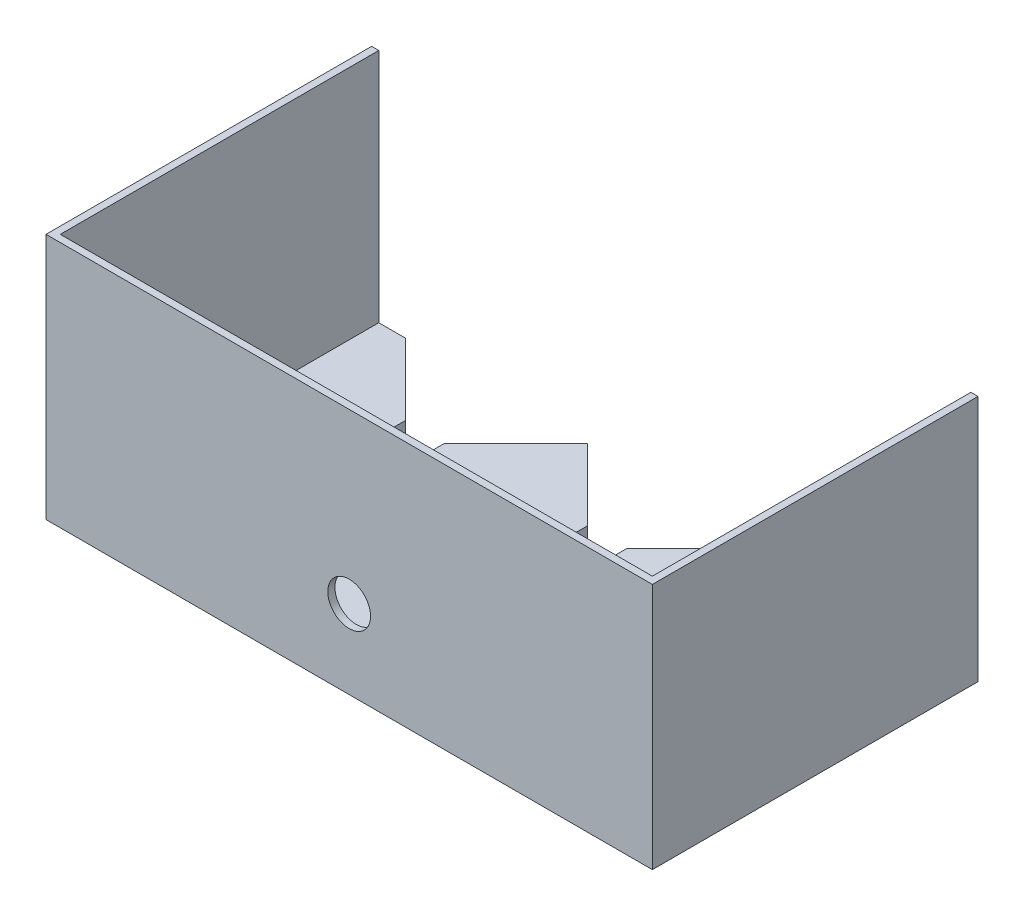
ISO-10303-21;
HEADER;
FILE_DESCRIPTION(('STEP AP214'),'2;1');
FILE_NAME('part.step','',(''),(''),'','','');
FILE_SCHEMA(('AUTOMOTIVE_DESIGN { 1 0 10303 214 1 1 1 1 }'));
ENDSEC;
DATA;
#1=APPLICATION_CONTEXT('core data for automotive mechanical design processes');
#2=APPLICATION_PROTOCOL_DEFINITION('international standard','automotive_design',2000,#1);
#3=PRODUCT_CONTEXT('',#1,'mechanical');
#4=PRODUCT('Part','Part','',(#3));
#5=PRODUCT_RELATED_PRODUCT_CATEGORY('part','',(#4));
#6=PRODUCT_DEFINITION_FORMATION('','',#4);
#7=PRODUCT_DEFINITION_CONTEXT('part definition',#1,'design');
#8=PRODUCT_DEFINITION('design','',#6,#7);
#9=PRODUCT_DEFINITION_SHAPE('','',#8);
#10=(LENGTH_UNIT() NAMED_UNIT(*) SI_UNIT(.MILLI.,.METRE.));
#11=(NAMED_UNIT(*) PLANE_ANGLE_UNIT() SI_UNIT($,.RADIAN.));
#12=(NAMED_UNIT(*) SI_UNIT($,.STERADIAN.) SOLID_ANGLE_UNIT());
#13=UNCERTAINTY_MEASURE_WITH_UNIT(LENGTH_MEASURE(1.E-05),#10,'distance_accuracy_value','');
#14=(GEOMETRIC_REPRESENTATION_CONTEXT(3) GLOBAL_UNCERTAINTY_ASSIGNED_CONTEXT((#13)) GLOBAL_UNIT_ASSIGNED_CONTEXT((#10,
#11,#12)) REPRESENTATION_CONTEXT('',''));
#15=CARTESIAN_POINT('',(0.,0.,0.));
#16=DIRECTION('',(0.,0.,1.));
#17=DIRECTION('',(1.,0.,0.));
#18=AXIS2_PLACEMENT_3D('',#15,#16,#17);
#19=CARTESIAN_POINT('',(0.,10.,0.));
#20=DIRECTION('',(0.,1.,0.));
#21=DIRECTION('',(0.,0.,1.));
#22=AXIS2_PLACEMENT_3D('',#19,#20,#21);
#23=PLANE('',#22);
#24=DIRECTION('',(1.,0.,0.));
#25=VECTOR('',#24,1.);
#26=CARTESIAN_POINT('',(0.,10.,-249.222409476411));
#27=LINE('',#26,#25);
#28=CARTESIAN_POINT('',(-63.1740525057557,10.,-249.222409476411));
#29=VERTEX_POINT('',#28);
#30=CARTESIAN_POINT('',(-39.5240525057557,10.,-249.222409476411));
#31=VERTEX_POINT('',#30);
#32=EDGE_CURVE('E60',#29,#31,#27,.T.);
#33=ORIENTED_EDGE('',*,*,#32,.F.);
#34=DIRECTION('',(0.,0.,1.));
#35=VECTOR('',#34,1.);
#36=CARTESIAN_POINT('',(-63.1740525057557,10.,-249.222409476411));
#37=LINE('',#36,#35);
#38=CARTESIAN_POINT('',(-63.1740525057556,10.,34.4275905235894));
#39=VERTEX_POINT('',#38);
#40=EDGE_CURVE('E373',#29,#39,#37,.T.);
#41=ORIENTED_EDGE('',*,*,#40,.T.);
#42=DIRECTION('',(1.,0.,0.));
#43=VECTOR('',#42,1.);
#44=CARTESIAN_POINT('',(-63.1740525057556,10.,34.4275905235894));
#45=LINE('',#44,#43);
#46=CARTESIAN_POINT('',(464.125947494244,10.,34.4275905235894));
#47=VERTEX_POINT('',#46);
#48=EDGE_CURVE('E376',#39,#47,#45,.T.);
#49=ORIENTED_EDGE('',*,*,#48,.T.);
#50=DIRECTION('',(0.,0.,-1.));
#51=VECTOR('',#50,1.);
#52=CARTESIAN_POINT('',(464.125947494244,10.,34.4275905235894));
#53=LINE('',#52,#51);
#54=CARTESIAN_POINT('',(464.125947494244,10.,-249.22240947641));
#55=VERTEX_POINT('',#54);
#56=EDGE_CURVE('E354',#47,#55,#53,.T.);
#57=ORIENTED_EDGE('',*,*,#56,.T.);
#58=DIRECTION('',(1.,0.,0.));
#59=VECTOR('',#58,1.);
#60=CARTESIAN_POINT('',(7.76319446984428E-12,10.,-249.222409476424));
#61=LINE('',#60,#59);
#62=CARTESIAN_POINT('',(445.526846859234,10.,-249.22240947641));
#63=VERTEX_POINT('',#62);
#64=EDGE_CURVE('E267',#63,#55,#61,.T.);
#65=ORIENTED_EDGE('',*,*,#64,.F.);
#66=DIRECTION('',(0.707106781186539,0.,-0.707106781186556));
#67=VECTOR('',#66,1.);
#68=CARTESIAN_POINT('',(98.1522186914172,10.,98.1522186914148));
#69=LINE('',#68,#67);
#70=CARTESIAN_POINT('',(381.887236552446,10.,-185.582799169621));
#71=VERTEX_POINT('',#70);
#72=EDGE_CURVE('E384',#71,#63,#69,.T.);
#73=ORIENTED_EDGE('',*,*,#72,.F.);
#74=DIRECTION('',(0.,0.,-1.));
#75=VECTOR('',#74,1.);
#76=CARTESIAN_POINT('',(381.887236552446,10.,0.));
#77=LINE('',#76,#75);
#78=CARTESIAN_POINT('',(381.887236552446,10.,-105.582799169621));
#79=VERTEX_POINT('',#78);
#80=EDGE_CURVE('E387',#79,#71,#77,.T.);
#81=ORIENTED_EDGE('',*,*,#80,.F.);
#82=DIRECTION('',(1.,0.,0.));
#83=VECTOR('',#82,1.);
#84=CARTESIAN_POINT('',(0.,10.,-105.582799169621));
#85=LINE('',#84,#83);
#86=CARTESIAN_POINT('',(346.887236552446,10.,-105.582799169621));
#87=VERTEX_POINT('',#86);
#88=EDGE_CURVE('E390',#87,#79,#85,.T.);
#89=ORIENTED_EDGE('',*,*,#88,.F.);
#90=DIRECTION('',(0.,0.,1.));
#91=VECTOR('',#90,1.);
#92=CARTESIAN_POINT('',(346.887236552446,10.,0.));
#93=LINE('',#92,#91);
#94=CARTESIAN_POINT('',(346.887236552446,10.,-183.796036693877));
#95=VERTEX_POINT('',#94);
#96=EDGE_CURVE('E393',#95,#87,#93,.T.);
#97=ORIENTED_EDGE('',*,*,#96,.F.);
#98=DIRECTION('',(0.707106781186546,0.,0.707106781186549));
#99=VECTOR('',#98,1.);
#100=CARTESIAN_POINT('',(265.341636623162,10.,-265.341636623161));
#101=LINE('',#100,#99);
#102=CARTESIAN_POINT('',(283.247626245657,10.,-247.435647000666));
#103=VERTEX_POINT('',#102);
#104=EDGE_CURVE('E396',#103,#95,#101,.T.);
#105=ORIENTED_EDGE('',*,*,#104,.F.);
#106=DIRECTION('',(0.707106781186546,0.,-0.707106781186549));
#107=VECTOR('',#106,1.);
#108=CARTESIAN_POINT('',(17.905989622496,10.,17.9059896224959));
#109=LINE('',#108,#107);
#110=CARTESIAN_POINT('',(221.394778414612,10.,-185.582799169621));
#111=VERTEX_POINT('',#110);
#112=EDGE_CURVE('E399',#111,#103,#109,.T.);
#113=ORIENTED_EDGE('',*,*,#112,.F.);
#114=DIRECTION('',(0.,0.,-1.));
#115=VECTOR('',#114,1.);
#116=CARTESIAN_POINT('',(221.394778414612,10.,0.));
#117=LINE('',#116,#115);
#118=CARTESIAN_POINT('',(221.394778414612,10.,-105.582799169621));
#119=VERTEX_POINT('',#118);
#120=EDGE_CURVE('E402',#119,#111,#117,.T.);
#121=ORIENTED_EDGE('',*,*,#120,.F.);
#122=DIRECTION('',(1.,0.,0.));
#123=VECTOR('',#122,1.);
#124=CARTESIAN_POINT('',(0.,10.,-105.582799169621));
#125=LINE('',#124,#123);
#126=CARTESIAN_POINT('',(186.394778414612,10.,-105.582799169621));
#127=VERTEX_POINT('',#126);
#128=EDGE_CURVE('E405',#127,#119,#125,.T.);
#129=ORIENTED_EDGE('',*,*,#128,.F.);
#130=DIRECTION('',(0.,0.,1.));
#131=VECTOR('',#130,1.);
#132=CARTESIAN_POINT('',(186.394778414612,10.,0.));
#133=LINE('',#132,#131);
#134=CARTESIAN_POINT('',(186.394778414612,10.,-185.582799169621));
#135=VERTEX_POINT('',#134);
#136=EDGE_CURVE('E408',#135,#127,#133,.T.);
#137=ORIENTED_EDGE('',*,*,#136,.F.);
#138=DIRECTION('',(0.707106781186546,0.,0.707106781186549));
#139=VECTOR('',#138,1.);
#140=CARTESIAN_POINT('',(185.988788792117,10.,-185.988788792116));
#141=LINE('',#140,#139);
#142=CARTESIAN_POINT('',(122.755168107823,10.,-249.22240947641));
#143=VERTEX_POINT('',#142);
#144=EDGE_CURVE('E411',#143,#135,#141,.T.);
#145=ORIENTED_EDGE('',*,*,#144,.F.);
#146=DIRECTION('',(0.707106781186548,0.,-0.707106781186548));
#147=VECTOR('',#146,1.);
#148=CARTESIAN_POINT('',(-63.2336206842938,10.,-63.2336206842938));
#149=LINE('',#148,#147);
#150=CARTESIAN_POINT('',(59.1155578010336,10.,-185.582799169621));
#151=VERTEX_POINT('',#150);
#152=EDGE_CURVE('E414',#151,#143,#149,.T.);
#153=ORIENTED_EDGE('',*,*,#152,.F.);
#154=DIRECTION('',(0.,0.,-1.));
#155=VECTOR('',#154,1.);
#156=CARTESIAN_POINT('',(59.1155578010336,10.,0.));
#157=LINE('',#156,#155);
#158=CARTESIAN_POINT('',(59.1155578010336,10.,-105.582799169621));
#159=VERTEX_POINT('',#158);
#160=EDGE_CURVE('E202',#159,#151,#157,.T.);
#161=ORIENTED_EDGE('',*,*,#160,.F.);
#162=DIRECTION('',(1.,0.,0.));
#163=VECTOR('',#162,1.);
#164=CARTESIAN_POINT('',(0.,10.,-105.582799169621));
#165=LINE('',#164,#163);
#166=CARTESIAN_POINT('',(24.1155578010336,10.,-105.582799169621));
#167=VERTEX_POINT('',#166);
#168=EDGE_CURVE('E184',#167,#159,#165,.T.);
#169=ORIENTED_EDGE('',*,*,#168,.F.);
#170=DIRECTION('',(0.,0.,1.));
#171=VECTOR('',#170,1.);
#172=CARTESIAN_POINT('',(24.1155578010336,10.,0.));
#173=LINE('',#172,#171);
#174=CARTESIAN_POINT('',(24.1155578010336,10.,-185.582799169621));
#175=VERTEX_POINT('',#174);
#176=EDGE_CURVE('E198',#175,#167,#173,.T.);
#177=ORIENTED_EDGE('',*,*,#176,.F.);
#178=DIRECTION('',(0.707106781186548,0.,0.707106781186548));
#179=VECTOR('',#178,1.);
#180=CARTESIAN_POINT('',(104.849178485327,10.,-104.849178485327));
#181=LINE('',#180,#179);
#182=EDGE_CURVE('E205',#31,#175,#181,.T.);
#183=ORIENTED_EDGE('',*,*,#182,.F.);
#184=EDGE_LOOP('',(#33,#41,#49,#57,#65,#73,#81,#89,#97,#105,#113,#121,#129,#137,#145,#153,#161,
#169,#177,#183));
#185=FACE_BOUND('',#184,.T.);
#186=ADVANCED_FACE('F35',(#185),#23,.T.);
#187=CARTESIAN_POINT('',(-69.5240525057557,10.,0.));
#188=DIRECTION('',(-1.,0.,0.));
#189=DIRECTION('',(0.,0.,1.));
#190=AXIS2_PLACEMENT_3D('',#187,#188,#189);
#191=PLANE('',#190);
#192=DIRECTION('',(0.,0.,-1.));
#193=VECTOR('',#192,1.);
#194=CARTESIAN_POINT('',(-69.5240525057557,0.,0.));
#195=LINE('',#194,#193);
#196=CARTESIAN_POINT('',(-69.5240525057557,0.,40.7775905235894));
#197=VERTEX_POINT('',#196);
#198=CARTESIAN_POINT('',(-69.5240525057557,0.,-249.222409476411));
#199=VERTEX_POINT('',#198);
#200=EDGE_CURVE('E211',#197,#199,#195,.T.);
#201=ORIENTED_EDGE('',*,*,#200,.F.);
#202=DIRECTION('',(0.,-1.,0.));
#203=VECTOR('',#202,1.);
#204=CARTESIAN_POINT('',(-69.5240525057557,10.,40.7775905235894));
#205=LINE('',#204,#203);
#206=CARTESIAN_POINT('',(-69.5240525057557,220.,40.7775905235894));
#207=VERTEX_POINT('',#206);
#208=EDGE_CURVE('E11',#207,#197,#205,.T.);
#209=ORIENTED_EDGE('',*,*,#208,.F.);
#210=DIRECTION('',(0.,0.,-1.));
#211=VECTOR('',#210,1.);
#212=CARTESIAN_POINT('',(-69.5240525057557,220.,40.7775905235894));
#213=LINE('',#212,#211);
#214=CARTESIAN_POINT('',(-69.5240525057557,220.,-249.222409476411));
#215=VERTEX_POINT('',#214);
#216=EDGE_CURVE('E428',#207,#215,#213,.T.);
#217=ORIENTED_EDGE('',*,*,#216,.T.);
#218=DIRECTION('',(0.,-1.,0.));
#219=VECTOR('',#218,1.);
#220=CARTESIAN_POINT('',(-69.5240525057557,10.,-249.222409476411));
#221=LINE('',#220,#219);
#222=EDGE_CURVE('E129',#215,#199,#221,.T.);
#223=ORIENTED_EDGE('',*,*,#222,.T.);
#224=EDGE_LOOP('',(#201,#209,#217,#223));
#225=FACE_BOUND('',#224,.T.);
#226=ADVANCED_FACE('F37',(#225),#191,.T.);
#227=CARTESIAN_POINT('',(0.,10.,40.7775905235894));
#228=DIRECTION('',(0.,0.,-1.));
#229=DIRECTION('',(-1.,0.,0.));
#230=AXIS2_PLACEMENT_3D('',#227,#228,#229);
#231=PLANE('',#230);
#232=CARTESIAN_POINT('',(200.475947494244,70.,40.7775905235894));
#233=DIRECTION('',(0.,0.,1.));
#234=DIRECTION('',(1.,0.,0.));
#235=AXIS2_PLACEMENT_3D('',#232,#233,#234);
#236=CIRCLE('',#235,19.05);
#237=CARTESIAN_POINT('',(219.525947494244,70.,40.7775905235894));
#238=VERTEX_POINT('',#237);
#239=EDGE_CURVE('E432',#238,#238,#236,.T.);
#240=ORIENTED_EDGE('',*,*,#239,.F.);
#241=EDGE_LOOP('',(#240));
#242=FACE_BOUND('',#241,.T.);
#243=DIRECTION('',(1.,0.,0.));
#244=VECTOR('',#243,1.);
#245=CARTESIAN_POINT('',(0.,0.,40.7775905235894));
#246=LINE('',#245,#244);
#247=CARTESIAN_POINT('',(470.475947494244,0.,40.7775905235894));
#248=VERTEX_POINT('',#247);
#249=EDGE_CURVE('E213',#197,#248,#246,.T.);
#250=ORIENTED_EDGE('',*,*,#249,.T.);
#251=DIRECTION('',(0.,-1.,0.));
#252=VECTOR('',#251,1.);
#253=CARTESIAN_POINT('',(470.475947494244,10.,40.7775905235894));
#254=LINE('',#253,#252);
#255=CARTESIAN_POINT('',(470.475947494244,220.,40.7775905235894));
#256=VERTEX_POINT('',#255);
#257=EDGE_CURVE('E44',#256,#248,#254,.T.);
#258=ORIENTED_EDGE('',*,*,#257,.F.);
#259=DIRECTION('',(-1.,0.,0.));
#260=VECTOR('',#259,1.);
#261=CARTESIAN_POINT('',(470.475947494244,220.,40.7775905235894));
#262=LINE('',#261,#260);
#263=EDGE_CURVE('E379',#256,#207,#262,.T.);
#264=ORIENTED_EDGE('',*,*,#263,.T.);
#265=ORIENTED_EDGE('',*,*,#208,.T.);
#266=EDGE_LOOP('',(#250,#258,#264,#265));
#267=FACE_BOUND('',#266,.T.);
#268=ADVANCED_FACE('F310',(#242,#267),#231,.F.);
#269=CARTESIAN_POINT('',(470.475947494244,10.,0.));
#270=DIRECTION('',(1.,0.,0.));
#271=DIRECTION('',(0.,0.,-1.));
#272=AXIS2_PLACEMENT_3D('',#269,#270,#271);
#273=PLANE('',#272);
#274=DIRECTION('',(0.,0.,1.));
#275=VECTOR('',#274,1.);
#276=CARTESIAN_POINT('',(470.475947494244,0.,0.));
#277=LINE('',#276,#275);
#278=CARTESIAN_POINT('',(470.475947494244,0.,-249.22240947641));
#279=VERTEX_POINT('',#278);
#280=EDGE_CURVE('E216',#279,#248,#277,.T.);
#281=ORIENTED_EDGE('',*,*,#280,.F.);
#282=DIRECTION('',(0.,-1.,0.));
#283=VECTOR('',#282,1.);
#284=CARTESIAN_POINT('',(470.475947494244,10.,-249.22240947641));
#285=LINE('',#284,#283);
#286=CARTESIAN_POINT('',(470.475947494244,220.,-249.22240947641));
#287=VERTEX_POINT('',#286);
#288=EDGE_CURVE('E296',#287,#279,#285,.T.);
#289=ORIENTED_EDGE('',*,*,#288,.F.);
#290=DIRECTION('',(0.,0.,1.));
#291=VECTOR('',#290,1.);
#292=CARTESIAN_POINT('',(470.475947494244,220.,-249.22240947641));
#293=LINE('',#292,#291);
#294=EDGE_CURVE('E305',#287,#256,#293,.T.);
#295=ORIENTED_EDGE('',*,*,#294,.T.);
#296=ORIENTED_EDGE('',*,*,#257,.T.);
#297=EDGE_LOOP('',(#281,#289,#295,#296));
#298=FACE_BOUND('',#297,.T.);
#299=ADVANCED_FACE('F302',(#298),#273,.T.);
#300=CARTESIAN_POINT('',(7.76319446984428E-12,10.,-249.222409476424));
#301=DIRECTION('',(0.,0.,-1.));
#302=DIRECTION('',(-1.,0.,0.));
#303=AXIS2_PLACEMENT_3D('',#300,#301,#302);
#304=PLANE('',#303);
#305=DIRECTION('',(1.,0.,0.));
#306=VECTOR('',#305,1.);
#307=CARTESIAN_POINT('',(7.76319446984428E-12,0.,-249.222409476424));
#308=LINE('',#307,#306);
#309=CARTESIAN_POINT('',(445.526846859234,0.,-249.22240947641));
#310=VERTEX_POINT('',#309);
#311=EDGE_CURVE('E219',#310,#279,#308,.T.);
#312=ORIENTED_EDGE('',*,*,#311,.F.);
#313=DIRECTION('',(0.,-1.,0.));
#314=VECTOR('',#313,1.);
#315=CARTESIAN_POINT('',(445.526846859234,10.,-249.22240947641));
#316=LINE('',#315,#314);
#317=EDGE_CURVE('E137',#63,#310,#316,.T.);
#318=ORIENTED_EDGE('',*,*,#317,.F.);
#319=ORIENTED_EDGE('',*,*,#64,.T.);
#320=DIRECTION('',(0.,-1.,0.));
#321=VECTOR('',#320,1.);
#322=CARTESIAN_POINT('',(464.125947494244,220.,-249.22240947641));
#323=LINE('',#322,#321);
#324=CARTESIAN_POINT('',(464.125947494244,220.,-249.22240947641));
#325=VERTEX_POINT('',#324);
#326=EDGE_CURVE('E51',#325,#55,#323,.T.);
#327=ORIENTED_EDGE('',*,*,#326,.F.);
#328=DIRECTION('',(1.,0.,1.13644876536434E-13));
#329=VECTOR('',#328,1.);
#330=CARTESIAN_POINT('',(464.125947494244,220.,-249.22240947641));
#331=LINE('',#330,#329);
#332=EDGE_CURVE('E319',#325,#287,#331,.T.);
#333=ORIENTED_EDGE('',*,*,#332,.T.);
#334=ORIENTED_EDGE('',*,*,#288,.T.);
#335=EDGE_LOOP('',(#312,#318,#319,#327,#333,#334));
#336=FACE_BOUND('',#335,.T.);
#337=ADVANCED_FACE('F315',(#336),#304,.T.);
#338=CARTESIAN_POINT('',(98.1522186914172,10.,98.1522186914148));
#339=DIRECTION('',(-0.707106781186556,0.,-0.707106781186539));
#340=DIRECTION('',(-0.707106781186539,0.,0.707106781186556));
#341=AXIS2_PLACEMENT_3D('',#338,#339,#340);
#342=PLANE('',#341);
#343=DIRECTION('',(0.707106781186539,0.,-0.707106781186556));
#344=VECTOR('',#343,1.);
#345=CARTESIAN_POINT('',(98.1522186914172,0.,98.1522186914148));
#346=LINE('',#345,#344);
#347=CARTESIAN_POINT('',(381.887236552446,0.,-185.582799169621));
#348=VERTEX_POINT('',#347);
#349=EDGE_CURVE('E222',#348,#310,#346,.T.);
#350=ORIENTED_EDGE('',*,*,#349,.F.);
#351=DIRECTION('',(0.,-1.,0.));
#352=VECTOR('',#351,1.);
#353=CARTESIAN_POINT('',(381.887236552446,10.,-185.582799169621));
#354=LINE('',#353,#352);
#355=EDGE_CURVE('E293',#71,#348,#354,.T.);
#356=ORIENTED_EDGE('',*,*,#355,.F.);
#357=ORIENTED_EDGE('',*,*,#72,.T.);
#358=ORIENTED_EDGE('',*,*,#317,.T.);
#359=EDGE_LOOP('',(#350,#356,#357,#358));
#360=FACE_BOUND('',#359,.T.);
#361=ADVANCED_FACE('F508',(#360),#342,.T.);
#362=CARTESIAN_POINT('',(381.887236552446,10.,0.));
#363=DIRECTION('',(-1.,0.,0.));
#364=DIRECTION('',(0.,0.,1.));
#365=AXIS2_PLACEMENT_3D('',#362,#363,#364);
#366=PLANE('',#365);
#367=DIRECTION('',(0.,0.,-1.));
#368=VECTOR('',#367,1.);
#369=CARTESIAN_POINT('',(381.887236552446,0.,0.));
#370=LINE('',#369,#368);
#371=CARTESIAN_POINT('',(381.887236552446,0.,-105.582799169621));
#372=VERTEX_POINT('',#371);
#373=EDGE_CURVE('E225',#372,#348,#370,.T.);
#374=ORIENTED_EDGE('',*,*,#373,.F.);
#375=DIRECTION('',(0.,-1.,0.));
#376=VECTOR('',#375,1.);
#377=CARTESIAN_POINT('',(381.887236552446,10.,-105.582799169621));
#378=LINE('',#377,#376);
#379=EDGE_CURVE('E291',#79,#372,#378,.T.);
#380=ORIENTED_EDGE('',*,*,#379,.F.);
#381=ORIENTED_EDGE('',*,*,#80,.T.);
#382=ORIENTED_EDGE('',*,*,#355,.T.);
#383=EDGE_LOOP('',(#374,#380,#381,#382));
#384=FACE_BOUND('',#383,.T.);
#385=ADVANCED_FACE('F504',(#384),#366,.T.);
#386=CARTESIAN_POINT('',(0.,10.,-105.582799169621));
#387=DIRECTION('',(0.,0.,-1.));
#388=DIRECTION('',(-1.,0.,0.));
#389=AXIS2_PLACEMENT_3D('',#386,#387,#388);
#390=PLANE('',#389);
#391=DIRECTION('',(1.,0.,0.));
#392=VECTOR('',#391,1.);
#393=CARTESIAN_POINT('',(0.,0.,-105.582799169621));
#394=LINE('',#393,#392);
#395=CARTESIAN_POINT('',(346.887236552446,0.,-105.582799169621));
#396=VERTEX_POINT('',#395);
#397=EDGE_CURVE('E228',#396,#372,#394,.T.);
#398=ORIENTED_EDGE('',*,*,#397,.F.);
#399=DIRECTION('',(0.,-1.,0.));
#400=VECTOR('',#399,1.);
#401=CARTESIAN_POINT('',(346.887236552446,10.,-105.582799169621));
#402=LINE('',#401,#400);
#403=EDGE_CURVE('E289',#87,#396,#402,.T.);
#404=ORIENTED_EDGE('',*,*,#403,.F.);
#405=ORIENTED_EDGE('',*,*,#88,.T.);
#406=ORIENTED_EDGE('',*,*,#379,.T.);
#407=EDGE_LOOP('',(#398,#404,#405,#406));
#408=FACE_BOUND('',#407,.T.);
#409=ADVANCED_FACE('F500',(#408),#390,.T.);
#410=CARTESIAN_POINT('',(346.887236552446,10.,0.));
#411=DIRECTION('',(1.,0.,0.));
#412=DIRECTION('',(0.,0.,-1.));
#413=AXIS2_PLACEMENT_3D('',#410,#411,#412);
#414=PLANE('',#413);
#415=DIRECTION('',(0.,0.,1.));
#416=VECTOR('',#415,1.);
#417=CARTESIAN_POINT('',(346.887236552446,0.,0.));
#418=LINE('',#417,#416);
#419=CARTESIAN_POINT('',(346.887236552446,0.,-183.796036693877));
#420=VERTEX_POINT('',#419);
#421=EDGE_CURVE('E231',#420,#396,#418,.T.);
#422=ORIENTED_EDGE('',*,*,#421,.F.);
#423=DIRECTION('',(0.,-1.,0.));
#424=VECTOR('',#423,1.);
#425=CARTESIAN_POINT('',(346.887236552446,10.,-183.796036693877));
#426=LINE('',#425,#424);
#427=EDGE_CURVE('E287',#95,#420,#426,.T.);
#428=ORIENTED_EDGE('',*,*,#427,.F.);
#429=ORIENTED_EDGE('',*,*,#96,.T.);
#430=ORIENTED_EDGE('',*,*,#403,.T.);
#431=EDGE_LOOP('',(#422,#428,#429,#430));
#432=FACE_BOUND('',#431,.T.);
#433=ADVANCED_FACE('F496',(#432),#414,.T.);
#434=CARTESIAN_POINT('',(265.341636623162,10.,-265.341636623161));
#435=DIRECTION('',(0.707106781186549,0.,-0.707106781186546));
#436=DIRECTION('',(-0.707106781186546,0.,-0.707106781186549));
#437=AXIS2_PLACEMENT_3D('',#434,#435,#436);
#438=PLANE('',#437);
#439=DIRECTION('',(0.707106781186546,0.,0.707106781186549));
#440=VECTOR('',#439,1.);
#441=CARTESIAN_POINT('',(265.341636623162,0.,-265.341636623161));
#442=LINE('',#441,#440);
#443=CARTESIAN_POINT('',(283.247626245657,0.,-247.435647000666));
#444=VERTEX_POINT('',#443);
#445=EDGE_CURVE('E234',#444,#420,#442,.T.);
#446=ORIENTED_EDGE('',*,*,#445,.F.);
#447=DIRECTION('',(0.,-1.,0.));
#448=VECTOR('',#447,1.);
#449=CARTESIAN_POINT('',(283.247626245657,10.,-247.435647000666));
#450=LINE('',#449,#448);
#451=EDGE_CURVE('E285',#103,#444,#450,.T.);
#452=ORIENTED_EDGE('',*,*,#451,.F.);
#453=ORIENTED_EDGE('',*,*,#104,.T.);
#454=ORIENTED_EDGE('',*,*,#427,.T.);
#455=EDGE_LOOP('',(#446,#452,#453,#454));
#456=FACE_BOUND('',#455,.T.);
#457=ADVANCED_FACE('F492',(#456),#438,.T.);
#458=CARTESIAN_POINT('',(17.905989622496,10.,17.9059896224959));
#459=DIRECTION('',(-0.707106781186549,0.,-0.707106781186546));
#460=DIRECTION('',(-0.707106781186546,0.,0.707106781186549));
#461=AXIS2_PLACEMENT_3D('',#458,#459,#460);
#462=PLANE('',#461);
#463=DIRECTION('',(0.707106781186546,0.,-0.707106781186549));
#464=VECTOR('',#463,1.);
#465=CARTESIAN_POINT('',(17.905989622496,0.,17.9059896224959));
#466=LINE('',#465,#464);
#467=CARTESIAN_POINT('',(221.394778414612,0.,-185.582799169621));
#468=VERTEX_POINT('',#467);
#469=EDGE_CURVE('E237',#468,#444,#466,.T.);
#470=ORIENTED_EDGE('',*,*,#469,.F.);
#471=DIRECTION('',(0.,-1.,0.));
#472=VECTOR('',#471,1.);
#473=CARTESIAN_POINT('',(221.394778414612,10.,-185.582799169621));
#474=LINE('',#473,#472);
#475=EDGE_CURVE('E283',#111,#468,#474,.T.);
#476=ORIENTED_EDGE('',*,*,#475,.F.);
#477=ORIENTED_EDGE('',*,*,#112,.T.);
#478=ORIENTED_EDGE('',*,*,#451,.T.);
#479=EDGE_LOOP('',(#470,#476,#477,#478));
#480=FACE_BOUND('',#479,.T.);
#481=ADVANCED_FACE('F488',(#480),#462,.T.);
#482=CARTESIAN_POINT('',(221.394778414612,10.,0.));
#483=DIRECTION('',(-1.,0.,0.));
#484=DIRECTION('',(0.,0.,1.));
#485=AXIS2_PLACEMENT_3D('',#482,#483,#484);
#486=PLANE('',#485);
#487=DIRECTION('',(0.,0.,-1.));
#488=VECTOR('',#487,1.);
#489=CARTESIAN_POINT('',(221.394778414612,0.,0.));
#490=LINE('',#489,#488);
#491=CARTESIAN_POINT('',(221.394778414612,0.,-105.582799169621));
#492=VERTEX_POINT('',#491);
#493=EDGE_CURVE('E240',#492,#468,#490,.T.);
#494=ORIENTED_EDGE('',*,*,#493,.F.);
#495=DIRECTION('',(0.,-1.,0.));
#496=VECTOR('',#495,1.);
#497=CARTESIAN_POINT('',(221.394778414612,10.,-105.582799169621));
#498=LINE('',#497,#496);
#499=EDGE_CURVE('E281',#119,#492,#498,.T.);
#500=ORIENTED_EDGE('',*,*,#499,.F.);
#501=ORIENTED_EDGE('',*,*,#120,.T.);
#502=ORIENTED_EDGE('',*,*,#475,.T.);
#503=EDGE_LOOP('',(#494,#500,#501,#502));
#504=FACE_BOUND('',#503,.T.);
#505=ADVANCED_FACE('F484',(#504),#486,.T.);
#506=CARTESIAN_POINT('',(0.,10.,-105.582799169621));
#507=DIRECTION('',(0.,0.,-1.));
#508=DIRECTION('',(-1.,0.,0.));
#509=AXIS2_PLACEMENT_3D('',#506,#507,#508);
#510=PLANE('',#509);
#511=DIRECTION('',(1.,0.,0.));
#512=VECTOR('',#511,1.);
#513=CARTESIAN_POINT('',(0.,0.,-105.582799169621));
#514=LINE('',#513,#512);
#515=CARTESIAN_POINT('',(186.394778414612,0.,-105.582799169621));
#516=VERTEX_POINT('',#515);
#517=EDGE_CURVE('E243',#516,#492,#514,.T.);
#518=ORIENTED_EDGE('',*,*,#517,.F.);
#519=DIRECTION('',(0.,-1.,0.));
#520=VECTOR('',#519,1.);
#521=CARTESIAN_POINT('',(186.394778414612,10.,-105.582799169621));
#522=LINE('',#521,#520);
#523=EDGE_CURVE('E279',#127,#516,#522,.T.);
#524=ORIENTED_EDGE('',*,*,#523,.F.);
#525=ORIENTED_EDGE('',*,*,#128,.T.);
#526=ORIENTED_EDGE('',*,*,#499,.T.);
#527=EDGE_LOOP('',(#518,#524,#525,#526));
#528=FACE_BOUND('',#527,.T.);
#529=ADVANCED_FACE('F480',(#528),#510,.T.);
#530=CARTESIAN_POINT('',(186.394778414612,10.,0.));
#531=DIRECTION('',(1.,0.,0.));
#532=DIRECTION('',(0.,0.,-1.));
#533=AXIS2_PLACEMENT_3D('',#530,#531,#532);
#534=PLANE('',#533);
#535=DIRECTION('',(0.,0.,1.));
#536=VECTOR('',#535,1.);
#537=CARTESIAN_POINT('',(186.394778414612,0.,0.));
#538=LINE('',#537,#536);
#539=CARTESIAN_POINT('',(186.394778414612,0.,-185.582799169621));
#540=VERTEX_POINT('',#539);
#541=EDGE_CURVE('E246',#540,#516,#538,.T.);
#542=ORIENTED_EDGE('',*,*,#541,.F.);
#543=DIRECTION('',(0.,-1.,0.));
#544=VECTOR('',#543,1.);
#545=CARTESIAN_POINT('',(186.394778414612,10.,-185.582799169621));
#546=LINE('',#545,#544);
#547=EDGE_CURVE('E277',#135,#540,#546,.T.);
#548=ORIENTED_EDGE('',*,*,#547,.F.);
#549=ORIENTED_EDGE('',*,*,#136,.T.);
#550=ORIENTED_EDGE('',*,*,#523,.T.);
#551=EDGE_LOOP('',(#542,#548,#549,#550));
#552=FACE_BOUND('',#551,.T.);
#553=ADVANCED_FACE('F476',(#552),#534,.T.);
#554=CARTESIAN_POINT('',(185.988788792117,10.,-185.988788792116));
#555=DIRECTION('',(0.707106781186549,0.,-0.707106781186546));
#556=DIRECTION('',(-0.707106781186546,0.,-0.707106781186549));
#557=AXIS2_PLACEMENT_3D('',#554,#555,#556);
#558=PLANE('',#557);
#559=DIRECTION('',(0.707106781186546,0.,0.707106781186549));
#560=VECTOR('',#559,1.);
#561=CARTESIAN_POINT('',(185.988788792117,0.,-185.988788792116));
#562=LINE('',#561,#560);
#563=CARTESIAN_POINT('',(122.755168107823,0.,-249.22240947641));
#564=VERTEX_POINT('',#563);
#565=EDGE_CURVE('E249',#564,#540,#562,.T.);
#566=ORIENTED_EDGE('',*,*,#565,.F.);
#567=DIRECTION('',(0.,-1.,0.));
#568=VECTOR('',#567,1.);
#569=CARTESIAN_POINT('',(122.755168107823,10.,-249.22240947641));
#570=LINE('',#569,#568);
#571=EDGE_CURVE('E275',#143,#564,#570,.T.);
#572=ORIENTED_EDGE('',*,*,#571,.F.);
#573=ORIENTED_EDGE('',*,*,#144,.T.);
#574=ORIENTED_EDGE('',*,*,#547,.T.);
#575=EDGE_LOOP('',(#566,#572,#573,#574));
#576=FACE_BOUND('',#575,.T.);
#577=ADVANCED_FACE('F472',(#576),#558,.T.);
#578=CARTESIAN_POINT('',(-63.2336206842938,10.,-63.2336206842938));
#579=DIRECTION('',(-0.707106781186548,0.,-0.707106781186548));
#580=DIRECTION('',(-0.707106781186548,0.,0.707106781186548));
#581=AXIS2_PLACEMENT_3D('',#578,#579,#580);
#582=PLANE('',#581);
#583=DIRECTION('',(0.707106781186548,0.,-0.707106781186548));
#584=VECTOR('',#583,1.);
#585=CARTESIAN_POINT('',(-63.2336206842938,0.,-63.2336206842938));
#586=LINE('',#585,#584);
#587=CARTESIAN_POINT('',(59.1155578010336,0.,-185.582799169621));
#588=VERTEX_POINT('',#587);
#589=EDGE_CURVE('E252',#588,#564,#586,.T.);
#590=ORIENTED_EDGE('',*,*,#589,.F.);
#591=DIRECTION('',(0.,-1.,0.));
#592=VECTOR('',#591,1.);
#593=CARTESIAN_POINT('',(59.1155578010336,10.,-185.582799169621));
#594=LINE('',#593,#592);
#595=EDGE_CURVE('E273',#151,#588,#594,.T.);
#596=ORIENTED_EDGE('',*,*,#595,.F.);
#597=ORIENTED_EDGE('',*,*,#152,.T.);
#598=ORIENTED_EDGE('',*,*,#571,.T.);
#599=EDGE_LOOP('',(#590,#596,#597,#598));
#600=FACE_BOUND('',#599,.T.);
#601=ADVANCED_FACE('F469',(#600),#582,.T.);
#602=CARTESIAN_POINT('',(59.1155578010336,10.,0.));
#603=DIRECTION('',(-1.,0.,0.));
#604=DIRECTION('',(0.,0.,1.));
#605=AXIS2_PLACEMENT_3D('',#602,#603,#604);
#606=PLANE('',#605);
#607=DIRECTION('',(0.,0.,-1.));
#608=VECTOR('',#607,1.);
#609=CARTESIAN_POINT('',(59.1155578010336,0.,0.));
#610=LINE('',#609,#608);
#611=CARTESIAN_POINT('',(59.1155578010336,0.,-105.582799169621));
#612=VERTEX_POINT('',#611);
#613=EDGE_CURVE('E255',#612,#588,#610,.T.);
#614=ORIENTED_EDGE('',*,*,#613,.F.);
#615=DIRECTION('',(0.,-1.,0.));
#616=VECTOR('',#615,1.);
#617=CARTESIAN_POINT('',(59.1155578010336,10.,-105.582799169621));
#618=LINE('',#617,#616);
#619=EDGE_CURVE('E191',#159,#612,#618,.T.);
#620=ORIENTED_EDGE('',*,*,#619,.F.);
#621=ORIENTED_EDGE('',*,*,#160,.T.);
#622=ORIENTED_EDGE('',*,*,#595,.T.);
#623=EDGE_LOOP('',(#614,#620,#621,#622));
#624=FACE_BOUND('',#623,.T.);
#625=ADVANCED_FACE('F418',(#624),#606,.T.);
#626=CARTESIAN_POINT('',(0.,10.,-105.582799169621));
#627=DIRECTION('',(0.,0.,-1.));
#628=DIRECTION('',(-1.,0.,0.));
#629=AXIS2_PLACEMENT_3D('',#626,#627,#628);
#630=PLANE('',#629);
#631=DIRECTION('',(1.,0.,0.));
#632=VECTOR('',#631,1.);
#633=CARTESIAN_POINT('',(0.,0.,-105.582799169621));
#634=LINE('',#633,#632);
#635=CARTESIAN_POINT('',(24.1155578010336,0.,-105.582799169621));
#636=VERTEX_POINT('',#635);
#637=EDGE_CURVE('E186',#636,#612,#634,.T.);
#638=ORIENTED_EDGE('',*,*,#637,.F.);
#639=DIRECTION('',(0.,-1.,0.));
#640=VECTOR('',#639,1.);
#641=CARTESIAN_POINT('',(24.1155578010336,10.,-105.582799169621));
#642=LINE('',#641,#640);
#643=EDGE_CURVE('E181',#167,#636,#642,.T.);
#644=ORIENTED_EDGE('',*,*,#643,.F.);
#645=ORIENTED_EDGE('',*,*,#168,.T.);
#646=ORIENTED_EDGE('',*,*,#619,.T.);
#647=EDGE_LOOP('',(#638,#644,#645,#646));
#648=FACE_BOUND('',#647,.T.);
#649=ADVANCED_FACE('F183',(#648),#630,.T.);
#650=CARTESIAN_POINT('',(24.1155578010336,10.,0.));
#651=DIRECTION('',(1.,0.,0.));
#652=DIRECTION('',(0.,0.,-1.));
#653=AXIS2_PLACEMENT_3D('',#650,#651,#652);
#654=PLANE('',#653);
#655=DIRECTION('',(0.,0.,1.));
#656=VECTOR('',#655,1.);
#657=CARTESIAN_POINT('',(24.1155578010336,0.,0.));
#658=LINE('',#657,#656);
#659=CARTESIAN_POINT('',(24.1155578010336,0.,-185.582799169621));
#660=VERTEX_POINT('',#659);
#661=EDGE_CURVE('E259',#660,#636,#658,.T.);
#662=ORIENTED_EDGE('',*,*,#661,.F.);
#663=DIRECTION('',(0.,-1.,0.));
#664=VECTOR('',#663,1.);
#665=CARTESIAN_POINT('',(24.1155578010336,10.,-185.582799169621));
#666=LINE('',#665,#664);
#667=EDGE_CURVE('E192',#175,#660,#666,.T.);
#668=ORIENTED_EDGE('',*,*,#667,.F.);
#669=ORIENTED_EDGE('',*,*,#176,.T.);
#670=ORIENTED_EDGE('',*,*,#643,.T.);
#671=EDGE_LOOP('',(#662,#668,#669,#670));
#672=FACE_BOUND('',#671,.T.);
#673=ADVANCED_FACE('F204',(#672),#654,.T.);
#674=CARTESIAN_POINT('',(104.849178485327,10.,-104.849178485327));
#675=DIRECTION('',(0.707106781186548,0.,-0.707106781186548));
#676=DIRECTION('',(-0.707106781186548,0.,-0.707106781186548));
#677=AXIS2_PLACEMENT_3D('',#674,#675,#676);
#678=PLANE('',#677);
#679=DIRECTION('',(0.707106781186548,0.,0.707106781186548));
#680=VECTOR('',#679,1.);
#681=CARTESIAN_POINT('',(104.849178485327,0.,-104.849178485327));
#682=LINE('',#681,#680);
#683=CARTESIAN_POINT('',(-39.5240525057557,0.,-249.222409476411));
#684=VERTEX_POINT('',#683);
#685=EDGE_CURVE('E261',#684,#660,#682,.T.);
#686=ORIENTED_EDGE('',*,*,#685,.F.);
#687=DIRECTION('',(0.,-1.,0.));
#688=VECTOR('',#687,1.);
#689=CARTESIAN_POINT('',(-39.5240525057557,10.,-249.222409476411));
#690=LINE('',#689,#688);
#691=EDGE_CURVE('E269',#31,#684,#690,.T.);
#692=ORIENTED_EDGE('',*,*,#691,.F.);
#693=ORIENTED_EDGE('',*,*,#182,.T.);
#694=ORIENTED_EDGE('',*,*,#667,.T.);
#695=EDGE_LOOP('',(#686,#692,#693,#694));
#696=FACE_BOUND('',#695,.T.);
#697=ADVANCED_FACE('F423',(#696),#678,.T.);
#698=CARTESIAN_POINT('',(0.,10.,-249.222409476411));
#699=DIRECTION('',(0.,0.,-1.));
#700=DIRECTION('',(-1.,0.,0.));
#701=AXIS2_PLACEMENT_3D('',#698,#699,#700);
#702=PLANE('',#701);
#703=DIRECTION('',(1.,0.,0.));
#704=VECTOR('',#703,1.);
#705=CARTESIAN_POINT('',(0.,0.,-249.222409476411));
#706=LINE('',#705,#704);
#707=EDGE_CURVE('E264',#199,#684,#706,.T.);
#708=ORIENTED_EDGE('',*,*,#707,.F.);
#709=ORIENTED_EDGE('',*,*,#222,.F.);
#710=DIRECTION('',(1.,0.,0.));
#711=VECTOR('',#710,1.);
#712=CARTESIAN_POINT('',(-69.5240525057557,220.,-249.222409476411));
#713=LINE('',#712,#711);
#714=CARTESIAN_POINT('',(-63.1740525057557,220.,-249.222409476411));
#715=VERTEX_POINT('',#714);
#716=EDGE_CURVE('E366',#215,#715,#713,.T.);
#717=ORIENTED_EDGE('',*,*,#716,.T.);
#718=DIRECTION('',(0.,-1.,0.));
#719=VECTOR('',#718,1.);
#720=CARTESIAN_POINT('',(-63.1740525057557,220.,-249.222409476411));
#721=LINE('',#720,#719);
#722=EDGE_CURVE('E372',#715,#29,#721,.T.);
#723=ORIENTED_EDGE('',*,*,#722,.T.);
#724=ORIENTED_EDGE('',*,*,#32,.T.);
#725=ORIENTED_EDGE('',*,*,#691,.T.);
#726=EDGE_LOOP('',(#708,#709,#717,#723,#724,#725));
#727=FACE_BOUND('',#726,.T.);
#728=ADVANCED_FACE('F427',(#727),#702,.T.);
#729=CARTESIAN_POINT('',(0.,0.,0.));
#730=DIRECTION('',(0.,1.,0.));
#731=DIRECTION('',(0.,0.,1.));
#732=AXIS2_PLACEMENT_3D('',#729,#730,#731);
#733=PLANE('',#732);
#734=ORIENTED_EDGE('',*,*,#200,.T.);
#735=ORIENTED_EDGE('',*,*,#707,.T.);
#736=ORIENTED_EDGE('',*,*,#685,.T.);
#737=ORIENTED_EDGE('',*,*,#661,.T.);
#738=ORIENTED_EDGE('',*,*,#637,.T.);
#739=ORIENTED_EDGE('',*,*,#613,.T.);
#740=ORIENTED_EDGE('',*,*,#589,.T.);
#741=ORIENTED_EDGE('',*,*,#565,.T.);
#742=ORIENTED_EDGE('',*,*,#541,.T.);
#743=ORIENTED_EDGE('',*,*,#517,.T.);
#744=ORIENTED_EDGE('',*,*,#493,.T.);
#745=ORIENTED_EDGE('',*,*,#469,.T.);
#746=ORIENTED_EDGE('',*,*,#445,.T.);
#747=ORIENTED_EDGE('',*,*,#421,.T.);
#748=ORIENTED_EDGE('',*,*,#397,.T.);
#749=ORIENTED_EDGE('',*,*,#373,.T.);
#750=ORIENTED_EDGE('',*,*,#349,.T.);
#751=ORIENTED_EDGE('',*,*,#311,.T.);
#752=ORIENTED_EDGE('',*,*,#280,.T.);
#753=ORIENTED_EDGE('',*,*,#249,.F.);
#754=EDGE_LOOP('',(#734,#735,#736,#737,#738,#739,#740,#741,#742,#743,#744,#745,#746,#747,#748,
#749,#750,#751,#752,#753));
#755=FACE_BOUND('',#754,.T.);
#756=ADVANCED_FACE('F313',(#755),#733,.F.);
#757=CARTESIAN_POINT('',(464.125947494244,220.,34.4275905235894));
#758=DIRECTION('',(-1.,0.,0.));
#759=DIRECTION('',(0.,0.,1.));
#760=AXIS2_PLACEMENT_3D('',#757,#758,#759);
#761=PLANE('',#760);
#762=ORIENTED_EDGE('',*,*,#56,.F.);
#763=DIRECTION('',(0.,-1.,0.));
#764=VECTOR('',#763,1.);
#765=CARTESIAN_POINT('',(464.125947494244,220.,34.4275905235894));
#766=LINE('',#765,#764);
#767=CARTESIAN_POINT('',(464.125947494244,220.,34.4275905235894));
#768=VERTEX_POINT('',#767);
#769=EDGE_CURVE('E341',#768,#47,#766,.T.);
#770=ORIENTED_EDGE('',*,*,#769,.F.);
#771=DIRECTION('',(0.,0.,-1.));
#772=VECTOR('',#771,1.);
#773=CARTESIAN_POINT('',(464.125947494244,220.,34.4275905235894));
#774=LINE('',#773,#772);
#775=EDGE_CURVE('E353',#768,#325,#774,.T.);
#776=ORIENTED_EDGE('',*,*,#775,.T.);
#777=ORIENTED_EDGE('',*,*,#326,.T.);
#778=EDGE_LOOP('',(#762,#770,#776,#777));
#779=FACE_BOUND('',#778,.T.);
#780=ADVANCED_FACE('F352',(#779),#761,.T.);
#781=CARTESIAN_POINT('',(-63.1740525057556,220.,34.4275905235894));
#782=DIRECTION('',(0.,0.,-1.));
#783=DIRECTION('',(-1.,0.,0.));
#784=AXIS2_PLACEMENT_3D('',#781,#782,#783);
#785=PLANE('',#784);
#786=CARTESIAN_POINT('',(200.475947494244,70.,34.4275905235894));
#787=DIRECTION('',(0.,0.,-1.));
#788=DIRECTION('',(-1.,0.,0.));
#789=AXIS2_PLACEMENT_3D('',#786,#787,#788);
#790=CIRCLE('',#789,19.05);
#791=CARTESIAN_POINT('',(181.425947494244,70.,34.4275905235894));
#792=VERTEX_POINT('',#791);
#793=EDGE_CURVE('E39',#792,#792,#790,.T.);
#794=ORIENTED_EDGE('',*,*,#793,.F.);
#795=EDGE_LOOP('',(#794));
#796=FACE_BOUND('',#795,.T.);
#797=ORIENTED_EDGE('',*,*,#48,.F.);
#798=DIRECTION('',(0.,-1.,0.));
#799=VECTOR('',#798,1.);
#800=CARTESIAN_POINT('',(-63.1740525057556,220.,34.4275905235894));
#801=LINE('',#800,#799);
#802=CARTESIAN_POINT('',(-63.1740525057556,220.,34.4275905235894));
#803=VERTEX_POINT('',#802);
#804=EDGE_CURVE('E334',#803,#39,#801,.T.);
#805=ORIENTED_EDGE('',*,*,#804,.F.);
#806=DIRECTION('',(1.,0.,0.));
#807=VECTOR('',#806,1.);
#808=CARTESIAN_POINT('',(-63.1740525057556,220.,34.4275905235894));
#809=LINE('',#808,#807);
#810=EDGE_CURVE('E361',#803,#768,#809,.T.);
#811=ORIENTED_EDGE('',*,*,#810,.T.);
#812=ORIENTED_EDGE('',*,*,#769,.T.);
#813=EDGE_LOOP('',(#797,#805,#811,#812));
#814=FACE_BOUND('',#813,.T.);
#815=ADVANCED_FACE('F363',(#796,#814),#785,.T.);
#816=CARTESIAN_POINT('',(-63.1740525057557,220.,-249.222409476411));
#817=DIRECTION('',(1.,0.,0.));
#818=DIRECTION('',(0.,0.,-1.));
#819=AXIS2_PLACEMENT_3D('',#816,#817,#818);
#820=PLANE('',#819);
#821=ORIENTED_EDGE('',*,*,#40,.F.);
#822=ORIENTED_EDGE('',*,*,#722,.F.);
#823=DIRECTION('',(0.,0.,1.));
#824=VECTOR('',#823,1.);
#825=CARTESIAN_POINT('',(-63.1740525057557,220.,-249.222409476411));
#826=LINE('',#825,#824);
#827=EDGE_CURVE('E364',#715,#803,#826,.T.);
#828=ORIENTED_EDGE('',*,*,#827,.T.);
#829=ORIENTED_EDGE('',*,*,#804,.T.);
#830=EDGE_LOOP('',(#821,#822,#828,#829));
#831=FACE_BOUND('',#830,.T.);
#832=ADVANCED_FACE('F424',(#831),#820,.T.);
#833=CARTESIAN_POINT('',(0.,220.,0.));
#834=DIRECTION('',(0.,-1.,0.));
#835=DIRECTION('',(0.,0.,-1.));
#836=AXIS2_PLACEMENT_3D('',#833,#834,#835);
#837=PLANE('',#836);
#838=ORIENTED_EDGE('',*,*,#263,.F.);
#839=ORIENTED_EDGE('',*,*,#294,.F.);
#840=ORIENTED_EDGE('',*,*,#332,.F.);
#841=ORIENTED_EDGE('',*,*,#775,.F.);
#842=ORIENTED_EDGE('',*,*,#810,.F.);
#843=ORIENTED_EDGE('',*,*,#827,.F.);
#844=ORIENTED_EDGE('',*,*,#716,.F.);
#845=ORIENTED_EDGE('',*,*,#216,.F.);
#846=EDGE_LOOP('',(#838,#839,#840,#841,#842,#843,#844,#845));
#847=FACE_BOUND('',#846,.T.);
#848=ADVANCED_FACE('F359',(#847),#837,.F.);
#849=CARTESIAN_POINT('',(200.475947494244,70.,-249.222409476411));
#850=DIRECTION('',(0.,0.,1.));
#851=DIRECTION('',(1.,0.,0.));
#852=AXIS2_PLACEMENT_3D('',#849,#850,#851);
#853=CYLINDRICAL_SURFACE('',#852,19.05);
#854=ORIENTED_EDGE('',*,*,#793,.T.);
#855=EDGE_LOOP('',(#854));
#856=FACE_BOUND('',#855,.T.);
#857=ORIENTED_EDGE('',*,*,#239,.T.);
#858=EDGE_LOOP('',(#857));
#859=FACE_BOUND('',#858,.T.);
#860=ADVANCED_FACE('F439',(#856,#859),#853,.F.);
#861=CLOSED_SHELL('',(#186,#226,#268,#299,#337,#361,#385,#409,#433,#457,#481,#505,#529,#553,
#577,#601,#625,#649,#673,#697,#728,#756,#780,#815,#832,#848,#860));
#862=MANIFOLD_SOLID_BREP('B2',#861);
#863=ADVANCED_BREP_SHAPE_REPRESENTATION('',(#18,#862),#14);
#864=SHAPE_DEFINITION_REPRESENTATION(#9,#863);
ENDSEC;
END-ISO-10303-21;
